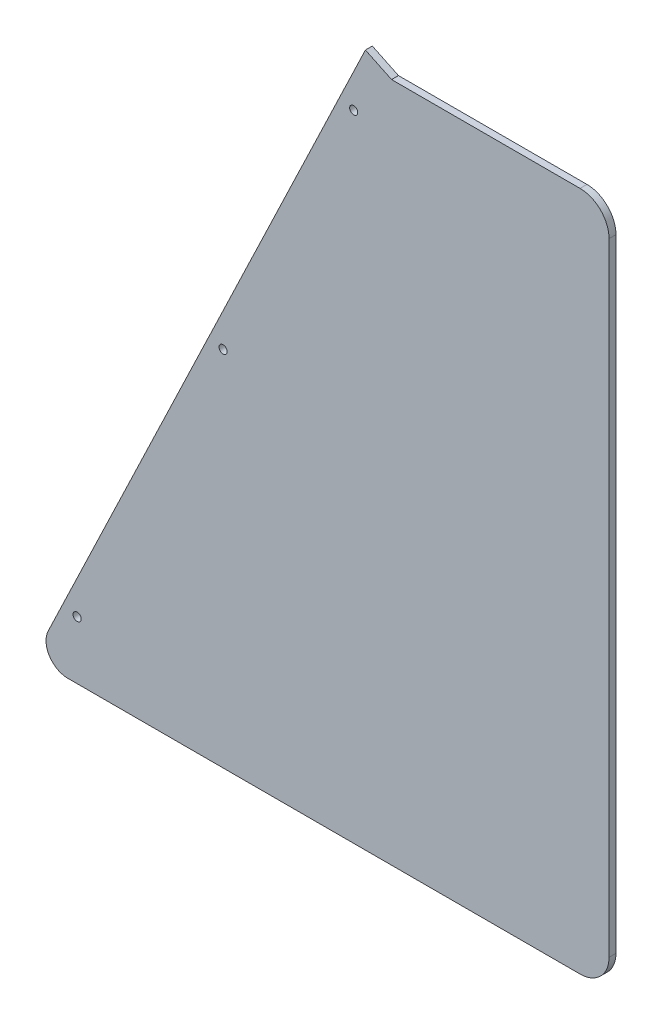
ISO-10303-21;
HEADER;
FILE_DESCRIPTION(('STEP AP214'),'2;1');
FILE_NAME('part.step','',(''),(''),'','','');
FILE_SCHEMA(('AUTOMOTIVE_DESIGN { 1 0 10303 214 1 1 1 1 }'));
ENDSEC;
DATA;
#1=APPLICATION_CONTEXT('core data for automotive mechanical design processes');
#2=APPLICATION_PROTOCOL_DEFINITION('international standard','automotive_design',2000,#1);
#3=PRODUCT_CONTEXT('',#1,'mechanical');
#4=PRODUCT('Part','Part','',(#3));
#5=PRODUCT_RELATED_PRODUCT_CATEGORY('part','',(#4));
#6=PRODUCT_DEFINITION_FORMATION('','',#4);
#7=PRODUCT_DEFINITION_CONTEXT('part definition',#1,'design');
#8=PRODUCT_DEFINITION('design','',#6,#7);
#9=PRODUCT_DEFINITION_SHAPE('','',#8);
#10=(LENGTH_UNIT() NAMED_UNIT(*) SI_UNIT(.MILLI.,.METRE.));
#11=(NAMED_UNIT(*) PLANE_ANGLE_UNIT() SI_UNIT($,.RADIAN.));
#12=(NAMED_UNIT(*) SI_UNIT($,.STERADIAN.) SOLID_ANGLE_UNIT());
#13=UNCERTAINTY_MEASURE_WITH_UNIT(LENGTH_MEASURE(1.E-05),#10,'distance_accuracy_value','');
#14=(GEOMETRIC_REPRESENTATION_CONTEXT(3) GLOBAL_UNCERTAINTY_ASSIGNED_CONTEXT((#13)) GLOBAL_UNIT_ASSIGNED_CONTEXT((#10,
#11,#12)) REPRESENTATION_CONTEXT('',''));
#15=CARTESIAN_POINT('',(0.,0.,0.));
#16=DIRECTION('',(0.,0.,1.));
#17=DIRECTION('',(1.,0.,0.));
#18=AXIS2_PLACEMENT_3D('',#15,#16,#17);
#19=CARTESIAN_POINT('',(-44.0903225806456,477.927471541562,-4.7625));
#20=DIRECTION('',(0.432258064516129,0.901749946304834,0.));
#21=DIRECTION('',(-0.901749946304834,0.432258064516129,0.));
#22=AXIS2_PLACEMENT_3D('',#19,#20,#21);
#23=PLANE('',#22);
#24=DIRECTION('',(-0.901749946304834,0.432258064516129,0.));
#25=VECTOR('',#24,1.);
#26=CARTESIAN_POINT('',(-44.0903225806456,477.927471541562,0.));
#27=LINE('',#26,#25);
#28=CARTESIAN_POINT('',(-26.0553236545488,469.282310251239,0.));
#29=VERTEX_POINT('',#28);
#30=CARTESIAN_POINT('',(-44.0903225806456,477.927471541562,0.));
#31=VERTEX_POINT('',#30);
#32=EDGE_CURVE('E131',#29,#31,#27,.T.);
#33=ORIENTED_EDGE('',*,*,#32,.F.);
#34=DIRECTION('',(0.,0.,1.));
#35=VECTOR('',#34,1.);
#36=CARTESIAN_POINT('',(-26.0553236545488,469.282310251239,-4.7625));
#37=LINE('',#36,#35);
#38=CARTESIAN_POINT('',(-26.0553236545488,469.282310251239,-4.7625));
#39=VERTEX_POINT('',#38);
#40=EDGE_CURVE('E11',#39,#29,#37,.T.);
#41=ORIENTED_EDGE('',*,*,#40,.F.);
#42=DIRECTION('',(-0.901749946304834,0.432258064516129,0.));
#43=VECTOR('',#42,1.);
#44=CARTESIAN_POINT('',(-44.0903225806456,477.927471541562,-4.7625));
#45=LINE('',#44,#43);
#46=CARTESIAN_POINT('',(-44.0903225806456,477.927471541562,-4.7625));
#47=VERTEX_POINT('',#46);
#48=EDGE_CURVE('E152',#39,#47,#45,.T.);
#49=ORIENTED_EDGE('',*,*,#48,.T.);
#50=DIRECTION('',(0.,0.,1.));
#51=VECTOR('',#50,1.);
#52=CARTESIAN_POINT('',(-44.0903225806456,477.927471541562,-4.7625));
#53=LINE('',#52,#51);
#54=EDGE_CURVE('E37',#47,#31,#53,.T.);
#55=ORIENTED_EDGE('',*,*,#54,.T.);
#56=EDGE_LOOP('',(#33,#41,#49,#55));
#57=FACE_BOUND('',#56,.T.);
#58=ADVANCED_FACE('F34',(#57),#23,.T.);
#59=CARTESIAN_POINT('',(-26.0553236545488,469.282310251239,-4.7625));
#60=DIRECTION('',(0.,1.,0.));
#61=DIRECTION('',(-1.,0.,0.));
#62=AXIS2_PLACEMENT_3D('',#59,#60,#61);
#63=PLANE('',#62);
#64=DIRECTION('',(-1.,0.,0.));
#65=VECTOR('',#64,1.);
#66=CARTESIAN_POINT('',(-26.0553236545488,469.282310251239,0.));
#67=LINE('',#66,#65);
#68=CARTESIAN_POINT('',(103.944676345451,469.282310251239,0.));
#69=VERTEX_POINT('',#68);
#70=EDGE_CURVE('E150',#69,#29,#67,.T.);
#71=ORIENTED_EDGE('',*,*,#70,.F.);
#72=DIRECTION('',(0.,0.,1.));
#73=VECTOR('',#72,1.);
#74=CARTESIAN_POINT('',(103.944676345451,469.282310251239,-4.7625));
#75=LINE('',#74,#73);
#76=CARTESIAN_POINT('',(103.944676345451,469.282310251239,-4.7625));
#77=VERTEX_POINT('',#76);
#78=EDGE_CURVE('E43',#77,#69,#75,.T.);
#79=ORIENTED_EDGE('',*,*,#78,.F.);
#80=DIRECTION('',(-1.,0.,0.));
#81=VECTOR('',#80,1.);
#82=CARTESIAN_POINT('',(-26.0553236545488,469.282310251239,-4.7625));
#83=LINE('',#82,#81);
#84=EDGE_CURVE('E121',#77,#39,#83,.T.);
#85=ORIENTED_EDGE('',*,*,#84,.T.);
#86=ORIENTED_EDGE('',*,*,#40,.T.);
#87=EDGE_LOOP('',(#71,#79,#85,#86));
#88=FACE_BOUND('',#87,.T.);
#89=ADVANCED_FACE('F164',(#88),#63,.T.);
#90=CARTESIAN_POINT('',(103.944676345451,449.282310251239,-4.7625));
#91=DIRECTION('',(0.,0.,1.));
#92=DIRECTION('',(1.,0.,0.));
#93=AXIS2_PLACEMENT_3D('',#90,#91,#92);
#94=CYLINDRICAL_SURFACE('',#93,20.);
#95=CARTESIAN_POINT('',(103.944676345451,449.282310251239,0.));
#96=DIRECTION('',(0.,0.,1.));
#97=DIRECTION('',(1.,0.,0.));
#98=AXIS2_PLACEMENT_3D('',#95,#96,#97);
#99=CIRCLE('',#98,20.);
#100=CARTESIAN_POINT('',(123.944676345451,449.282310251239,0.));
#101=VERTEX_POINT('',#100);
#102=EDGE_CURVE('E108',#101,#69,#99,.T.);
#103=ORIENTED_EDGE('',*,*,#102,.F.);
#104=DIRECTION('',(0.,0.,1.));
#105=VECTOR('',#104,1.);
#106=CARTESIAN_POINT('',(123.944676345451,449.282310251239,-4.7625));
#107=LINE('',#106,#105);
#108=CARTESIAN_POINT('',(123.944676345451,449.282310251239,-4.7625));
#109=VERTEX_POINT('',#108);
#110=EDGE_CURVE('E103',#109,#101,#107,.T.);
#111=ORIENTED_EDGE('',*,*,#110,.F.);
#112=CARTESIAN_POINT('',(103.944676345451,449.282310251239,-4.7625));
#113=DIRECTION('',(0.,0.,1.));
#114=DIRECTION('',(1.,0.,0.));
#115=AXIS2_PLACEMENT_3D('',#112,#113,#114);
#116=CIRCLE('',#115,20.);
#117=EDGE_CURVE('E106',#109,#77,#116,.T.);
#118=ORIENTED_EDGE('',*,*,#117,.T.);
#119=ORIENTED_EDGE('',*,*,#78,.T.);
#120=EDGE_LOOP('',(#103,#111,#118,#119));
#121=FACE_BOUND('',#120,.T.);
#122=ADVANCED_FACE('F105',(#121),#94,.T.);
#123=CARTESIAN_POINT('',(123.944676345451,449.282310251239,-4.7625));
#124=DIRECTION('',(1.,0.,0.));
#125=DIRECTION('',(0.,1.,0.));
#126=AXIS2_PLACEMENT_3D('',#123,#124,#125);
#127=PLANE('',#126);
#128=DIRECTION('',(0.,1.,0.));
#129=VECTOR('',#128,1.);
#130=CARTESIAN_POINT('',(123.944676345451,449.282310251239,0.));
#131=LINE('',#130,#129);
#132=CARTESIAN_POINT('',(123.944676345451,20.,0.));
#133=VERTEX_POINT('',#132);
#134=EDGE_CURVE('E147',#133,#101,#131,.T.);
#135=ORIENTED_EDGE('',*,*,#134,.F.);
#136=DIRECTION('',(0.,0.,1.));
#137=VECTOR('',#136,1.);
#138=CARTESIAN_POINT('',(123.944676345451,20.,-4.7625));
#139=LINE('',#138,#137);
#140=CARTESIAN_POINT('',(123.944676345451,20.,-4.7625));
#141=VERTEX_POINT('',#140);
#142=EDGE_CURVE('E113',#141,#133,#139,.T.);
#143=ORIENTED_EDGE('',*,*,#142,.F.);
#144=DIRECTION('',(0.,1.,0.));
#145=VECTOR('',#144,1.);
#146=CARTESIAN_POINT('',(123.944676345451,449.282310251239,-4.7625));
#147=LINE('',#146,#145);
#148=EDGE_CURVE('E119',#141,#109,#147,.T.);
#149=ORIENTED_EDGE('',*,*,#148,.T.);
#150=ORIENTED_EDGE('',*,*,#110,.T.);
#151=EDGE_LOOP('',(#135,#143,#149,#150));
#152=FACE_BOUND('',#151,.T.);
#153=ADVANCED_FACE('F123',(#152),#127,.T.);
#154=CARTESIAN_POINT('',(103.944676345451,20.,-4.7625));
#155=DIRECTION('',(0.,0.,1.));
#156=DIRECTION('',(1.,0.,0.));
#157=AXIS2_PLACEMENT_3D('',#154,#155,#156);
#158=CYLINDRICAL_SURFACE('',#157,20.);
#159=CARTESIAN_POINT('',(103.944676345451,20.,0.));
#160=DIRECTION('',(0.,0.,1.));
#161=DIRECTION('',(-1.,0.,0.));
#162=AXIS2_PLACEMENT_3D('',#159,#160,#161);
#163=CIRCLE('',#162,20.);
#164=CARTESIAN_POINT('',(103.944676345451,0.,0.));
#165=VERTEX_POINT('',#164);
#166=EDGE_CURVE('E144',#165,#133,#163,.T.);
#167=ORIENTED_EDGE('',*,*,#166,.F.);
#168=DIRECTION('',(0.,0.,1.));
#169=VECTOR('',#168,1.);
#170=CARTESIAN_POINT('',(103.944676345451,0.,-4.7625));
#171=LINE('',#170,#169);
#172=CARTESIAN_POINT('',(103.944676345451,0.,-4.7625));
#173=VERTEX_POINT('',#172);
#174=EDGE_CURVE('E156',#173,#165,#171,.T.);
#175=ORIENTED_EDGE('',*,*,#174,.F.);
#176=CARTESIAN_POINT('',(103.944676345451,20.,-4.7625));
#177=DIRECTION('',(0.,0.,1.));
#178=DIRECTION('',(-1.,0.,0.));
#179=AXIS2_PLACEMENT_3D('',#176,#177,#178);
#180=CIRCLE('',#179,20.);
#181=EDGE_CURVE('E124',#173,#141,#180,.T.);
#182=ORIENTED_EDGE('',*,*,#181,.T.);
#183=ORIENTED_EDGE('',*,*,#142,.T.);
#184=EDGE_LOOP('',(#167,#175,#182,#183));
#185=FACE_BOUND('',#184,.T.);
#186=ADVANCED_FACE('F177',(#185),#158,.T.);
#187=CARTESIAN_POINT('',(103.944676345451,0.,-4.7625));
#188=DIRECTION('',(0.,-1.,0.));
#189=DIRECTION('',(1.,0.,0.));
#190=AXIS2_PLACEMENT_3D('',#187,#188,#189);
#191=PLANE('',#190);
#192=DIRECTION('',(1.,0.,0.));
#193=VECTOR('',#192,1.);
#194=CARTESIAN_POINT('',(103.944676345451,0.,0.));
#195=LINE('',#194,#193);
#196=CARTESIAN_POINT('',(-249.362453306481,0.,0.));
#197=VERTEX_POINT('',#196);
#198=EDGE_CURVE('E141',#197,#165,#195,.T.);
#199=ORIENTED_EDGE('',*,*,#198,.F.);
#200=DIRECTION('',(0.,0.,1.));
#201=VECTOR('',#200,1.);
#202=CARTESIAN_POINT('',(-249.362453306481,0.,-4.7625));
#203=LINE('',#202,#201);
#204=CARTESIAN_POINT('',(-249.362453306481,0.,-4.7625));
#205=VERTEX_POINT('',#204);
#206=EDGE_CURVE('E158',#205,#197,#203,.T.);
#207=ORIENTED_EDGE('',*,*,#206,.F.);
#208=DIRECTION('',(1.,0.,0.));
#209=VECTOR('',#208,1.);
#210=CARTESIAN_POINT('',(103.944676345451,0.,-4.7625));
#211=LINE('',#210,#209);
#212=EDGE_CURVE('E126',#205,#173,#211,.T.);
#213=ORIENTED_EDGE('',*,*,#212,.T.);
#214=ORIENTED_EDGE('',*,*,#174,.T.);
#215=EDGE_LOOP('',(#199,#207,#213,#214));
#216=FACE_BOUND('',#215,.T.);
#217=ADVANCED_FACE('F180',(#216),#191,.T.);
#218=CARTESIAN_POINT('',(-249.362453306481,15.,-4.7625));
#219=DIRECTION('',(0.,0.,1.));
#220=DIRECTION('',(1.,0.,0.));
#221=AXIS2_PLACEMENT_3D('',#218,#219,#220);
#222=CYLINDRICAL_SURFACE('',#221,15.);
#223=CARTESIAN_POINT('',(-249.362453306481,15.,0.));
#224=DIRECTION('',(0.,0.,1.));
#225=DIRECTION('',(-1.,0.,0.));
#226=AXIS2_PLACEMENT_3D('',#223,#224,#225);
#227=CIRCLE('',#226,15.);
#228=CARTESIAN_POINT('',(-262.888702501054,21.4838709677419,0.));
#229=VERTEX_POINT('',#228);
#230=EDGE_CURVE('E138',#229,#197,#227,.T.);
#231=ORIENTED_EDGE('',*,*,#230,.F.);
#232=DIRECTION('',(0.,0.,1.));
#233=VECTOR('',#232,1.);
#234=CARTESIAN_POINT('',(-262.888702501054,21.4838709677419,-4.7625));
#235=LINE('',#234,#233);
#236=CARTESIAN_POINT('',(-262.888702501054,21.4838709677419,-4.7625));
#237=VERTEX_POINT('',#236);
#238=EDGE_CURVE('E159',#237,#229,#235,.T.);
#239=ORIENTED_EDGE('',*,*,#238,.F.);
#240=CARTESIAN_POINT('',(-249.362453306481,15.,-4.7625));
#241=DIRECTION('',(0.,0.,1.));
#242=DIRECTION('',(-1.,0.,0.));
#243=AXIS2_PLACEMENT_3D('',#240,#241,#242);
#244=CIRCLE('',#243,15.);
#245=EDGE_CURVE('E236',#237,#205,#244,.T.);
#246=ORIENTED_EDGE('',*,*,#245,.T.);
#247=ORIENTED_EDGE('',*,*,#206,.T.);
#248=EDGE_LOOP('',(#231,#239,#246,#247));
#249=FACE_BOUND('',#248,.T.);
#250=ADVANCED_FACE('F184',(#249),#222,.T.);
#251=CARTESIAN_POINT('',(-262.888702501054,21.4838709677419,-4.7625));
#252=DIRECTION('',(-0.901749946304833,0.432258064516129,0.));
#253=DIRECTION('',(-0.432258064516129,-0.901749946304834,0.));
#254=AXIS2_PLACEMENT_3D('',#251,#252,#253);
#255=PLANE('',#254);
#256=DIRECTION('',(-0.432258064516129,-0.901749946304834,0.));
#257=VECTOR('',#256,1.);
#258=CARTESIAN_POINT('',(-262.888702501054,21.4838709677419,0.));
#259=LINE('',#258,#257);
#260=EDGE_CURVE('E134',#31,#229,#259,.T.);
#261=ORIENTED_EDGE('',*,*,#260,.F.);
#262=ORIENTED_EDGE('',*,*,#54,.F.);
#263=DIRECTION('',(-0.432258064516129,-0.901749946304834,0.));
#264=VECTOR('',#263,1.);
#265=CARTESIAN_POINT('',(-262.888702501054,21.4838709677419,-4.7625));
#266=LINE('',#265,#264);
#267=EDGE_CURVE('E234',#47,#237,#266,.T.);
#268=ORIENTED_EDGE('',*,*,#267,.T.);
#269=ORIENTED_EDGE('',*,*,#238,.T.);
#270=EDGE_LOOP('',(#261,#262,#268,#269));
#271=FACE_BOUND('',#270,.T.);
#272=ADVANCED_FACE('F161',(#271),#255,.T.);
#273=CARTESIAN_POINT('',(103.944676345451,449.282310251239,-4.7625));
#274=DIRECTION('',(0.,0.,1.));
#275=DIRECTION('',(1.,0.,0.));
#276=AXIS2_PLACEMENT_3D('',#273,#274,#275);
#277=PLANE('',#276);
#278=CARTESIAN_POINT('',(-242.923360477369,40.,-4.7625));
#279=DIRECTION('',(0.,0.,1.));
#280=DIRECTION('',(1.,0.,0.));
#281=AXIS2_PLACEMENT_3D('',#278,#279,#280);
#282=CIRCLE('',#281,2.8);
#283=CARTESIAN_POINT('',(-240.123360477369,40.,-4.7625));
#284=VERTEX_POINT('',#283);
#285=EDGE_CURVE('E215',#284,#284,#282,.T.);
#286=ORIENTED_EDGE('',*,*,#285,.T.);
#287=EDGE_LOOP('',(#286));
#288=FACE_BOUND('',#287,.T.);
#289=CARTESIAN_POINT('',(-142.258875915591,250.,-4.7625));
#290=DIRECTION('',(0.,0.,1.));
#291=DIRECTION('',(1.,0.,0.));
#292=AXIS2_PLACEMENT_3D('',#289,#290,#291);
#293=CIRCLE('',#292,2.80000000000006);
#294=CARTESIAN_POINT('',(-139.458875915591,250.,-4.7625));
#295=VERTEX_POINT('',#294);
#296=EDGE_CURVE('E223',#295,#295,#293,.T.);
#297=ORIENTED_EDGE('',*,*,#296,.T.);
#298=EDGE_LOOP('',(#297));
#299=FACE_BOUND('',#298,.T.);
#300=CARTESIAN_POINT('',(-52.1749613549745,437.927471541562,-4.7625));
#301=DIRECTION('',(0.,0.,1.));
#302=DIRECTION('',(1.,0.,0.));
#303=AXIS2_PLACEMENT_3D('',#300,#301,#302);
#304=CIRCLE('',#303,2.80000000000005);
#305=CARTESIAN_POINT('',(-49.3749613549745,437.927471541562,-4.7625));
#306=VERTEX_POINT('',#305);
#307=EDGE_CURVE('E135',#306,#306,#304,.T.);
#308=ORIENTED_EDGE('',*,*,#307,.T.);
#309=EDGE_LOOP('',(#308));
#310=FACE_BOUND('',#309,.T.);
#311=ORIENTED_EDGE('',*,*,#48,.F.);
#312=ORIENTED_EDGE('',*,*,#84,.F.);
#313=ORIENTED_EDGE('',*,*,#117,.F.);
#314=ORIENTED_EDGE('',*,*,#148,.F.);
#315=ORIENTED_EDGE('',*,*,#181,.F.);
#316=ORIENTED_EDGE('',*,*,#212,.F.);
#317=ORIENTED_EDGE('',*,*,#245,.F.);
#318=ORIENTED_EDGE('',*,*,#267,.F.);
#319=EDGE_LOOP('',(#311,#312,#313,#314,#315,#316,#317,#318));
#320=FACE_BOUND('',#319,.T.);
#321=ADVANCED_FACE('F117',(#288,#299,#310,#320),#277,.F.);
#322=CARTESIAN_POINT('',(103.944676345451,449.282310251239,0.));
#323=DIRECTION('',(0.,0.,1.));
#324=DIRECTION('',(1.,0.,0.));
#325=AXIS2_PLACEMENT_3D('',#322,#323,#324);
#326=PLANE('',#325);
#327=CARTESIAN_POINT('',(-242.923360477369,40.,0.));
#328=DIRECTION('',(0.,0.,1.));
#329=DIRECTION('',(1.,0.,0.));
#330=AXIS2_PLACEMENT_3D('',#327,#328,#329);
#331=CIRCLE('',#330,2.8);
#332=CARTESIAN_POINT('',(-240.123360477369,40.,0.));
#333=VERTEX_POINT('',#332);
#334=EDGE_CURVE('E218',#333,#333,#331,.T.);
#335=ORIENTED_EDGE('',*,*,#334,.F.);
#336=EDGE_LOOP('',(#335));
#337=FACE_BOUND('',#336,.T.);
#338=CARTESIAN_POINT('',(-142.258875915591,250.,0.));
#339=DIRECTION('',(0.,0.,1.));
#340=DIRECTION('',(1.,0.,0.));
#341=AXIS2_PLACEMENT_3D('',#338,#339,#340);
#342=CIRCLE('',#341,2.80000000000006);
#343=CARTESIAN_POINT('',(-139.458875915591,250.,0.));
#344=VERTEX_POINT('',#343);
#345=EDGE_CURVE('E220',#344,#344,#342,.T.);
#346=ORIENTED_EDGE('',*,*,#345,.F.);
#347=EDGE_LOOP('',(#346));
#348=FACE_BOUND('',#347,.T.);
#349=CARTESIAN_POINT('',(-52.1749613549745,437.927471541562,0.));
#350=DIRECTION('',(0.,0.,1.));
#351=DIRECTION('',(1.,0.,0.));
#352=AXIS2_PLACEMENT_3D('',#349,#350,#351);
#353=CIRCLE('',#352,2.80000000000005);
#354=CARTESIAN_POINT('',(-49.3749613549745,437.927471541562,0.));
#355=VERTEX_POINT('',#354);
#356=EDGE_CURVE('E226',#355,#355,#353,.T.);
#357=ORIENTED_EDGE('',*,*,#356,.F.);
#358=EDGE_LOOP('',(#357));
#359=FACE_BOUND('',#358,.T.);
#360=ORIENTED_EDGE('',*,*,#32,.T.);
#361=ORIENTED_EDGE('',*,*,#260,.T.);
#362=ORIENTED_EDGE('',*,*,#230,.T.);
#363=ORIENTED_EDGE('',*,*,#198,.T.);
#364=ORIENTED_EDGE('',*,*,#166,.T.);
#365=ORIENTED_EDGE('',*,*,#134,.T.);
#366=ORIENTED_EDGE('',*,*,#102,.T.);
#367=ORIENTED_EDGE('',*,*,#70,.T.);
#368=EDGE_LOOP('',(#360,#361,#362,#363,#364,#365,#366,#367));
#369=FACE_BOUND('',#368,.T.);
#370=ADVANCED_FACE('F163',(#337,#348,#359,#369),#326,.T.);
#371=CARTESIAN_POINT('',(-52.1749613549745,437.927471541562,-4.7625));
#372=DIRECTION('',(0.,0.,1.));
#373=DIRECTION('',(1.,0.,0.));
#374=AXIS2_PLACEMENT_3D('',#371,#372,#373);
#375=CYLINDRICAL_SURFACE('',#374,2.80000000000005);
#376=CARTESIAN_POINT('',(-49.3749613549745,437.927471541562,-4.7625));
#377=CARTESIAN_POINT('',(-49.3749613549745,437.927471541562,-4.712890625));
#378=CARTESIAN_POINT('',(-49.3749613549745,437.927471541562,-4.66328125));
#379=CARTESIAN_POINT('',(-49.3749613549745,437.927471541562,-4.5640625));
#380=CARTESIAN_POINT('',(-49.3749613549745,437.927471541562,-4.514453125));
#381=CARTESIAN_POINT('',(-49.3749613549745,437.927471541562,-4.415234375));
#382=CARTESIAN_POINT('',(-49.3749613549745,437.927471541562,-4.365625));
#383=CARTESIAN_POINT('',(-49.3749613549745,437.927471541562,-4.26640625));
#384=CARTESIAN_POINT('',(-49.3749613549745,437.927471541562,-4.216796875));
#385=CARTESIAN_POINT('',(-49.3749613549745,437.927471541562,-4.117578125));
#386=CARTESIAN_POINT('',(-49.3749613549745,437.927471541562,-4.06796875));
#387=CARTESIAN_POINT('',(-49.3749613549745,437.927471541562,-3.96875));
#388=CARTESIAN_POINT('',(-49.3749613549745,437.927471541562,-3.919140625));
#389=CARTESIAN_POINT('',(-49.3749613549745,437.927471541562,-3.819921875));
#390=CARTESIAN_POINT('',(-49.3749613549745,437.927471541562,-3.7703125));
#391=CARTESIAN_POINT('',(-49.3749613549745,437.927471541562,-3.67109375));
#392=CARTESIAN_POINT('',(-49.3749613549745,437.927471541562,-3.621484375));
#393=CARTESIAN_POINT('',(-49.3749613549745,437.927471541562,-3.522265625));
#394=CARTESIAN_POINT('',(-49.3749613549745,437.927471541562,-3.47265625));
#395=CARTESIAN_POINT('',(-49.3749613549745,437.927471541562,-3.3734375));
#396=CARTESIAN_POINT('',(-49.3749613549745,437.927471541562,-3.323828125));
#397=CARTESIAN_POINT('',(-49.3749613549745,437.927471541562,-3.224609375));
#398=CARTESIAN_POINT('',(-49.3749613549745,437.927471541562,-3.175));
#399=CARTESIAN_POINT('',(-49.3749613549745,437.927471541562,-3.07578125));
#400=CARTESIAN_POINT('',(-49.3749613549745,437.927471541562,-3.026171875));
#401=CARTESIAN_POINT('',(-49.3749613549745,437.927471541562,-2.926953125));
#402=CARTESIAN_POINT('',(-49.3749613549745,437.927471541562,-2.87734375));
#403=CARTESIAN_POINT('',(-49.3749613549745,437.927471541562,-2.778125));
#404=CARTESIAN_POINT('',(-49.3749613549745,437.927471541562,-2.728515625));
#405=CARTESIAN_POINT('',(-49.3749613549745,437.927471541562,-2.629296875));
#406=CARTESIAN_POINT('',(-49.3749613549745,437.927471541562,-2.5796875));
#407=CARTESIAN_POINT('',(-49.3749613549745,437.927471541562,-2.48046875));
#408=CARTESIAN_POINT('',(-49.3749613549745,437.927471541562,-2.430859375));
#409=CARTESIAN_POINT('',(-49.3749613549745,437.927471541562,-2.331640625));
#410=CARTESIAN_POINT('',(-49.3749613549745,437.927471541562,-2.28203125));
#411=CARTESIAN_POINT('',(-49.3749613549745,437.927471541562,-2.1828125));
#412=CARTESIAN_POINT('',(-49.3749613549745,437.927471541562,-2.133203125));
#413=CARTESIAN_POINT('',(-49.3749613549745,437.927471541562,-2.033984375));
#414=CARTESIAN_POINT('',(-49.3749613549745,437.927471541562,-1.984375));
#415=CARTESIAN_POINT('',(-49.3749613549745,437.927471541562,-1.88515625));
#416=CARTESIAN_POINT('',(-49.3749613549745,437.927471541562,-1.835546875));
#417=CARTESIAN_POINT('',(-49.3749613549745,437.927471541562,-1.736328125));
#418=CARTESIAN_POINT('',(-49.3749613549745,437.927471541562,-1.68671875));
#419=CARTESIAN_POINT('',(-49.3749613549745,437.927471541562,-1.5875));
#420=CARTESIAN_POINT('',(-49.3749613549745,437.927471541562,-1.537890625));
#421=CARTESIAN_POINT('',(-49.3749613549745,437.927471541562,-1.438671875));
#422=CARTESIAN_POINT('',(-49.3749613549745,437.927471541562,-1.3890625));
#423=CARTESIAN_POINT('',(-49.3749613549745,437.927471541562,-1.28984375));
#424=CARTESIAN_POINT('',(-49.3749613549745,437.927471541562,-1.240234375));
#425=CARTESIAN_POINT('',(-49.3749613549745,437.927471541562,-1.141015625));
#426=CARTESIAN_POINT('',(-49.3749613549745,437.927471541562,-1.09140625));
#427=CARTESIAN_POINT('',(-49.3749613549745,437.927471541562,-0.9921875));
#428=CARTESIAN_POINT('',(-49.3749613549745,437.927471541562,-0.942578125));
#429=CARTESIAN_POINT('',(-49.3749613549745,437.927471541562,-0.843359375));
#430=CARTESIAN_POINT('',(-49.3749613549745,437.927471541562,-0.79375));
#431=CARTESIAN_POINT('',(-49.3749613549745,437.927471541562,-0.69453125));
#432=CARTESIAN_POINT('',(-49.3749613549745,437.927471541562,-0.644921875));
#433=CARTESIAN_POINT('',(-49.3749613549745,437.927471541562,-0.545703125));
#434=CARTESIAN_POINT('',(-49.3749613549745,437.927471541562,-0.49609375));
#435=CARTESIAN_POINT('',(-49.3749613549745,437.927471541562,-0.396875));
#436=CARTESIAN_POINT('',(-49.3749613549745,437.927471541562,-0.347265625));
#437=CARTESIAN_POINT('',(-49.3749613549745,437.927471541562,-0.248046875));
#438=CARTESIAN_POINT('',(-49.3749613549745,437.927471541562,-0.1984375));
#439=CARTESIAN_POINT('',(-49.3749613549745,437.927471541562,-0.09921875));
#440=CARTESIAN_POINT('',(-49.3749613549745,437.927471541562,-0.049609375));
#441=CARTESIAN_POINT('',(-49.3749613549745,437.927471541562,0.));
#442=B_SPLINE_CURVE_WITH_KNOTS('',3,(#376,#377,#378,#379,#380,#381,#382,#383,#384,#385,#386,
#387,#388,#389,#390,#391,#392,#393,#394,#395,#396,#397,#398,#399,#400,#401,#402,#403,#404,#405,
#406,#407,#408,#409,#410,#411,#412,#413,#414,#415,#416,#417,#418,#419,#420,#421,#422,#423,#424,
#425,#426,#427,#428,#429,#430,#431,#432,#433,#434,#435,#436,#437,#438,#439,#440,#441),
.UNSPECIFIED.,.F.,.F.,(4,2,2,2,2,2,2,2,2,2,2,2,2,2,2,2,2,2,2,2,2,2,2,2,2,2,2,2,2,2,2,2,4),(0.,
0.148828125,0.29765625,0.446484375,0.5953125,0.744140625,0.892968750000001,1.041796875,1.190625,
1.339453125,1.48828125,1.637109375,1.7859375,1.934765625,2.08359375,2.232421875,2.38125,
2.530078125,2.67890625,2.827734375,2.9765625,3.125390625,3.27421875,3.423046875,3.571875,
3.720703125,3.86953125,4.018359375,4.1671875,4.316015625,4.46484375,4.613671875,4.7625),.UNSPECIFIED.);
#443=EDGE_CURVE('BSEAM196',#306,#355,#442,.T.);
#444=ORIENTED_EDGE('',*,*,#307,.F.);
#445=ORIENTED_EDGE('',*,*,#356,.T.);
#446=ORIENTED_EDGE('',*,*,#443,.T.);
#447=ORIENTED_EDGE('',*,*,#443,.F.);
#448=EDGE_LOOP('',(#444,#446,#445,#447));
#449=FACE_BOUND('',#448,.T.);
#450=ADVANCED_FACE('F196',(#449),#375,.F.);
#451=CARTESIAN_POINT('',(-142.258875915591,250.,-4.7625));
#452=DIRECTION('',(0.,0.,1.));
#453=DIRECTION('',(1.,0.,0.));
#454=AXIS2_PLACEMENT_3D('',#451,#452,#453);
#455=CYLINDRICAL_SURFACE('',#454,2.80000000000006);
#456=CARTESIAN_POINT('',(-139.458875915591,250.,-4.7625));
#457=CARTESIAN_POINT('',(-139.458875915591,250.,-4.712890625));
#458=CARTESIAN_POINT('',(-139.458875915591,250.,-4.66328125));
#459=CARTESIAN_POINT('',(-139.458875915591,250.,-4.5640625));
#460=CARTESIAN_POINT('',(-139.458875915591,250.,-4.514453125));
#461=CARTESIAN_POINT('',(-139.458875915591,250.,-4.415234375));
#462=CARTESIAN_POINT('',(-139.458875915591,250.,-4.365625));
#463=CARTESIAN_POINT('',(-139.458875915591,250.,-4.26640625));
#464=CARTESIAN_POINT('',(-139.458875915591,250.,-4.216796875));
#465=CARTESIAN_POINT('',(-139.458875915591,250.,-4.117578125));
#466=CARTESIAN_POINT('',(-139.458875915591,250.,-4.06796875));
#467=CARTESIAN_POINT('',(-139.458875915591,250.,-3.96875));
#468=CARTESIAN_POINT('',(-139.458875915591,250.,-3.919140625));
#469=CARTESIAN_POINT('',(-139.458875915591,250.,-3.819921875));
#470=CARTESIAN_POINT('',(-139.458875915591,250.,-3.7703125));
#471=CARTESIAN_POINT('',(-139.458875915591,250.,-3.67109375));
#472=CARTESIAN_POINT('',(-139.458875915591,250.,-3.621484375));
#473=CARTESIAN_POINT('',(-139.458875915591,250.,-3.522265625));
#474=CARTESIAN_POINT('',(-139.458875915591,250.,-3.47265625));
#475=CARTESIAN_POINT('',(-139.458875915591,250.,-3.3734375));
#476=CARTESIAN_POINT('',(-139.458875915591,250.,-3.323828125));
#477=CARTESIAN_POINT('',(-139.458875915591,250.,-3.224609375));
#478=CARTESIAN_POINT('',(-139.458875915591,250.,-3.175));
#479=CARTESIAN_POINT('',(-139.458875915591,250.,-3.07578125));
#480=CARTESIAN_POINT('',(-139.458875915591,250.,-3.026171875));
#481=CARTESIAN_POINT('',(-139.458875915591,250.,-2.926953125));
#482=CARTESIAN_POINT('',(-139.458875915591,250.,-2.87734375));
#483=CARTESIAN_POINT('',(-139.458875915591,250.,-2.778125));
#484=CARTESIAN_POINT('',(-139.458875915591,250.,-2.728515625));
#485=CARTESIAN_POINT('',(-139.458875915591,250.,-2.629296875));
#486=CARTESIAN_POINT('',(-139.458875915591,250.,-2.5796875));
#487=CARTESIAN_POINT('',(-139.458875915591,250.,-2.48046875));
#488=CARTESIAN_POINT('',(-139.458875915591,250.,-2.430859375));
#489=CARTESIAN_POINT('',(-139.458875915591,250.,-2.331640625));
#490=CARTESIAN_POINT('',(-139.458875915591,250.,-2.28203125));
#491=CARTESIAN_POINT('',(-139.458875915591,250.,-2.1828125));
#492=CARTESIAN_POINT('',(-139.458875915591,250.,-2.133203125));
#493=CARTESIAN_POINT('',(-139.458875915591,250.,-2.033984375));
#494=CARTESIAN_POINT('',(-139.458875915591,250.,-1.984375));
#495=CARTESIAN_POINT('',(-139.458875915591,250.,-1.88515625));
#496=CARTESIAN_POINT('',(-139.458875915591,250.,-1.835546875));
#497=CARTESIAN_POINT('',(-139.458875915591,250.,-1.736328125));
#498=CARTESIAN_POINT('',(-139.458875915591,250.,-1.68671875));
#499=CARTESIAN_POINT('',(-139.458875915591,250.,-1.5875));
#500=CARTESIAN_POINT('',(-139.458875915591,250.,-1.537890625));
#501=CARTESIAN_POINT('',(-139.458875915591,250.,-1.438671875));
#502=CARTESIAN_POINT('',(-139.458875915591,250.,-1.3890625));
#503=CARTESIAN_POINT('',(-139.458875915591,250.,-1.28984375));
#504=CARTESIAN_POINT('',(-139.458875915591,250.,-1.240234375));
#505=CARTESIAN_POINT('',(-139.458875915591,250.,-1.141015625));
#506=CARTESIAN_POINT('',(-139.458875915591,250.,-1.09140625));
#507=CARTESIAN_POINT('',(-139.458875915591,250.,-0.9921875));
#508=CARTESIAN_POINT('',(-139.458875915591,250.,-0.942578125));
#509=CARTESIAN_POINT('',(-139.458875915591,250.,-0.843359375));
#510=CARTESIAN_POINT('',(-139.458875915591,250.,-0.79375));
#511=CARTESIAN_POINT('',(-139.458875915591,250.,-0.69453125));
#512=CARTESIAN_POINT('',(-139.458875915591,250.,-0.644921875));
#513=CARTESIAN_POINT('',(-139.458875915591,250.,-0.545703125));
#514=CARTESIAN_POINT('',(-139.458875915591,250.,-0.49609375));
#515=CARTESIAN_POINT('',(-139.458875915591,250.,-0.396875));
#516=CARTESIAN_POINT('',(-139.458875915591,250.,-0.347265625));
#517=CARTESIAN_POINT('',(-139.458875915591,250.,-0.248046875));
#518=CARTESIAN_POINT('',(-139.458875915591,250.,-0.1984375));
#519=CARTESIAN_POINT('',(-139.458875915591,250.,-0.09921875));
#520=CARTESIAN_POINT('',(-139.458875915591,250.,-0.049609375));
#521=CARTESIAN_POINT('',(-139.458875915591,250.,0.));
#522=B_SPLINE_CURVE_WITH_KNOTS('',3,(#456,#457,#458,#459,#460,#461,#462,#463,#464,#465,#466,
#467,#468,#469,#470,#471,#472,#473,#474,#475,#476,#477,#478,#479,#480,#481,#482,#483,#484,#485,
#486,#487,#488,#489,#490,#491,#492,#493,#494,#495,#496,#497,#498,#499,#500,#501,#502,#503,#504,
#505,#506,#507,#508,#509,#510,#511,#512,#513,#514,#515,#516,#517,#518,#519,#520,#521),
.UNSPECIFIED.,.F.,.F.,(4,2,2,2,2,2,2,2,2,2,2,2,2,2,2,2,2,2,2,2,2,2,2,2,2,2,2,2,2,2,2,2,4),(0.,
0.148828125,0.29765625,0.446484375,0.5953125,0.744140625,0.892968750000001,1.041796875,1.190625,
1.339453125,1.48828125,1.637109375,1.7859375,1.934765625,2.08359375,2.232421875,2.38125,
2.530078125,2.67890625,2.827734375,2.9765625,3.125390625,3.27421875,3.423046875,3.571875,
3.720703125,3.86953125,4.018359375,4.1671875,4.316015625,4.46484375,4.613671875,4.7625),.UNSPECIFIED.);
#523=EDGE_CURVE('BSEAM203',#295,#344,#522,.T.);
#524=ORIENTED_EDGE('',*,*,#296,.F.);
#525=ORIENTED_EDGE('',*,*,#345,.T.);
#526=ORIENTED_EDGE('',*,*,#523,.T.);
#527=ORIENTED_EDGE('',*,*,#523,.F.);
#528=EDGE_LOOP('',(#524,#526,#525,#527));
#529=FACE_BOUND('',#528,.T.);
#530=ADVANCED_FACE('F203',(#529),#455,.F.);
#531=CARTESIAN_POINT('',(-242.923360477369,40.,-4.7625));
#532=DIRECTION('',(0.,0.,1.));
#533=DIRECTION('',(1.,0.,0.));
#534=AXIS2_PLACEMENT_3D('',#531,#532,#533);
#535=CYLINDRICAL_SURFACE('',#534,2.8);
#536=CARTESIAN_POINT('',(-240.123360477369,40.,-4.7625));
#537=CARTESIAN_POINT('',(-240.123360477369,40.,-4.712890625));
#538=CARTESIAN_POINT('',(-240.123360477369,40.,-4.66328125));
#539=CARTESIAN_POINT('',(-240.123360477369,40.,-4.5640625));
#540=CARTESIAN_POINT('',(-240.123360477369,40.,-4.514453125));
#541=CARTESIAN_POINT('',(-240.123360477369,40.,-4.415234375));
#542=CARTESIAN_POINT('',(-240.123360477369,40.,-4.365625));
#543=CARTESIAN_POINT('',(-240.123360477369,40.,-4.26640625));
#544=CARTESIAN_POINT('',(-240.123360477369,40.,-4.216796875));
#545=CARTESIAN_POINT('',(-240.123360477369,40.,-4.117578125));
#546=CARTESIAN_POINT('',(-240.123360477369,40.,-4.06796875));
#547=CARTESIAN_POINT('',(-240.123360477369,40.,-3.96875));
#548=CARTESIAN_POINT('',(-240.123360477369,40.,-3.919140625));
#549=CARTESIAN_POINT('',(-240.123360477369,40.,-3.819921875));
#550=CARTESIAN_POINT('',(-240.123360477369,40.,-3.7703125));
#551=CARTESIAN_POINT('',(-240.123360477369,40.,-3.67109375));
#552=CARTESIAN_POINT('',(-240.123360477369,40.,-3.621484375));
#553=CARTESIAN_POINT('',(-240.123360477369,40.,-3.522265625));
#554=CARTESIAN_POINT('',(-240.123360477369,40.,-3.47265625));
#555=CARTESIAN_POINT('',(-240.123360477369,40.,-3.3734375));
#556=CARTESIAN_POINT('',(-240.123360477369,40.,-3.323828125));
#557=CARTESIAN_POINT('',(-240.123360477369,40.,-3.224609375));
#558=CARTESIAN_POINT('',(-240.123360477369,40.,-3.175));
#559=CARTESIAN_POINT('',(-240.123360477369,40.,-3.07578125));
#560=CARTESIAN_POINT('',(-240.123360477369,40.,-3.026171875));
#561=CARTESIAN_POINT('',(-240.123360477369,40.,-2.926953125));
#562=CARTESIAN_POINT('',(-240.123360477369,40.,-2.87734375));
#563=CARTESIAN_POINT('',(-240.123360477369,40.,-2.778125));
#564=CARTESIAN_POINT('',(-240.123360477369,40.,-2.728515625));
#565=CARTESIAN_POINT('',(-240.123360477369,40.,-2.629296875));
#566=CARTESIAN_POINT('',(-240.123360477369,40.,-2.5796875));
#567=CARTESIAN_POINT('',(-240.123360477369,40.,-2.48046875));
#568=CARTESIAN_POINT('',(-240.123360477369,40.,-2.430859375));
#569=CARTESIAN_POINT('',(-240.123360477369,40.,-2.331640625));
#570=CARTESIAN_POINT('',(-240.123360477369,40.,-2.28203125));
#571=CARTESIAN_POINT('',(-240.123360477369,40.,-2.1828125));
#572=CARTESIAN_POINT('',(-240.123360477369,40.,-2.133203125));
#573=CARTESIAN_POINT('',(-240.123360477369,40.,-2.033984375));
#574=CARTESIAN_POINT('',(-240.123360477369,40.,-1.984375));
#575=CARTESIAN_POINT('',(-240.123360477369,40.,-1.88515625));
#576=CARTESIAN_POINT('',(-240.123360477369,40.,-1.835546875));
#577=CARTESIAN_POINT('',(-240.123360477369,40.,-1.736328125));
#578=CARTESIAN_POINT('',(-240.123360477369,40.,-1.68671875));
#579=CARTESIAN_POINT('',(-240.123360477369,40.,-1.5875));
#580=CARTESIAN_POINT('',(-240.123360477369,40.,-1.537890625));
#581=CARTESIAN_POINT('',(-240.123360477369,40.,-1.438671875));
#582=CARTESIAN_POINT('',(-240.123360477369,40.,-1.3890625));
#583=CARTESIAN_POINT('',(-240.123360477369,40.,-1.28984375));
#584=CARTESIAN_POINT('',(-240.123360477369,40.,-1.240234375));
#585=CARTESIAN_POINT('',(-240.123360477369,40.,-1.141015625));
#586=CARTESIAN_POINT('',(-240.123360477369,40.,-1.09140625));
#587=CARTESIAN_POINT('',(-240.123360477369,40.,-0.9921875));
#588=CARTESIAN_POINT('',(-240.123360477369,40.,-0.942578125));
#589=CARTESIAN_POINT('',(-240.123360477369,40.,-0.843359375));
#590=CARTESIAN_POINT('',(-240.123360477369,40.,-0.79375));
#591=CARTESIAN_POINT('',(-240.123360477369,40.,-0.69453125));
#592=CARTESIAN_POINT('',(-240.123360477369,40.,-0.644921875));
#593=CARTESIAN_POINT('',(-240.123360477369,40.,-0.545703125));
#594=CARTESIAN_POINT('',(-240.123360477369,40.,-0.49609375));
#595=CARTESIAN_POINT('',(-240.123360477369,40.,-0.396875));
#596=CARTESIAN_POINT('',(-240.123360477369,40.,-0.347265625));
#597=CARTESIAN_POINT('',(-240.123360477369,40.,-0.248046875));
#598=CARTESIAN_POINT('',(-240.123360477369,40.,-0.1984375));
#599=CARTESIAN_POINT('',(-240.123360477369,40.,-0.09921875));
#600=CARTESIAN_POINT('',(-240.123360477369,40.,-0.049609375));
#601=CARTESIAN_POINT('',(-240.123360477369,40.,0.));
#602=B_SPLINE_CURVE_WITH_KNOTS('',3,(#536,#537,#538,#539,#540,#541,#542,#543,#544,#545,#546,
#547,#548,#549,#550,#551,#552,#553,#554,#555,#556,#557,#558,#559,#560,#561,#562,#563,#564,#565,
#566,#567,#568,#569,#570,#571,#572,#573,#574,#575,#576,#577,#578,#579,#580,#581,#582,#583,#584,
#585,#586,#587,#588,#589,#590,#591,#592,#593,#594,#595,#596,#597,#598,#599,#600,#601),
.UNSPECIFIED.,.F.,.F.,(4,2,2,2,2,2,2,2,2,2,2,2,2,2,2,2,2,2,2,2,2,2,2,2,2,2,2,2,2,2,2,2,4),(0.,
0.148828125,0.29765625,0.446484375,0.5953125,0.744140625,0.892968750000001,1.041796875,1.190625,
1.339453125,1.48828125,1.637109375,1.7859375,1.934765625,2.08359375,2.232421875,2.38125,
2.530078125,2.67890625,2.827734375,2.9765625,3.125390625,3.27421875,3.423046875,3.571875,
3.720703125,3.86953125,4.018359375,4.1671875,4.316015625,4.46484375,4.613671875,4.7625),.UNSPECIFIED.);
#603=EDGE_CURVE('BSEAM207',#284,#333,#602,.T.);
#604=ORIENTED_EDGE('',*,*,#285,.F.);
#605=ORIENTED_EDGE('',*,*,#334,.T.);
#606=ORIENTED_EDGE('',*,*,#603,.T.);
#607=ORIENTED_EDGE('',*,*,#603,.F.);
#608=EDGE_LOOP('',(#604,#606,#605,#607));
#609=FACE_BOUND('',#608,.T.);
#610=ADVANCED_FACE('F207',(#609),#535,.F.);
#611=CLOSED_SHELL('',(#58,#89,#122,#153,#186,#217,#250,#272,#321,#370,#450,#530,#610));
#612=MANIFOLD_SOLID_BREP('B2',#611);
#613=ADVANCED_BREP_SHAPE_REPRESENTATION('',(#18,#612),#14);
#614=SHAPE_DEFINITION_REPRESENTATION(#9,#613);
ENDSEC;
END-ISO-10303-21;
